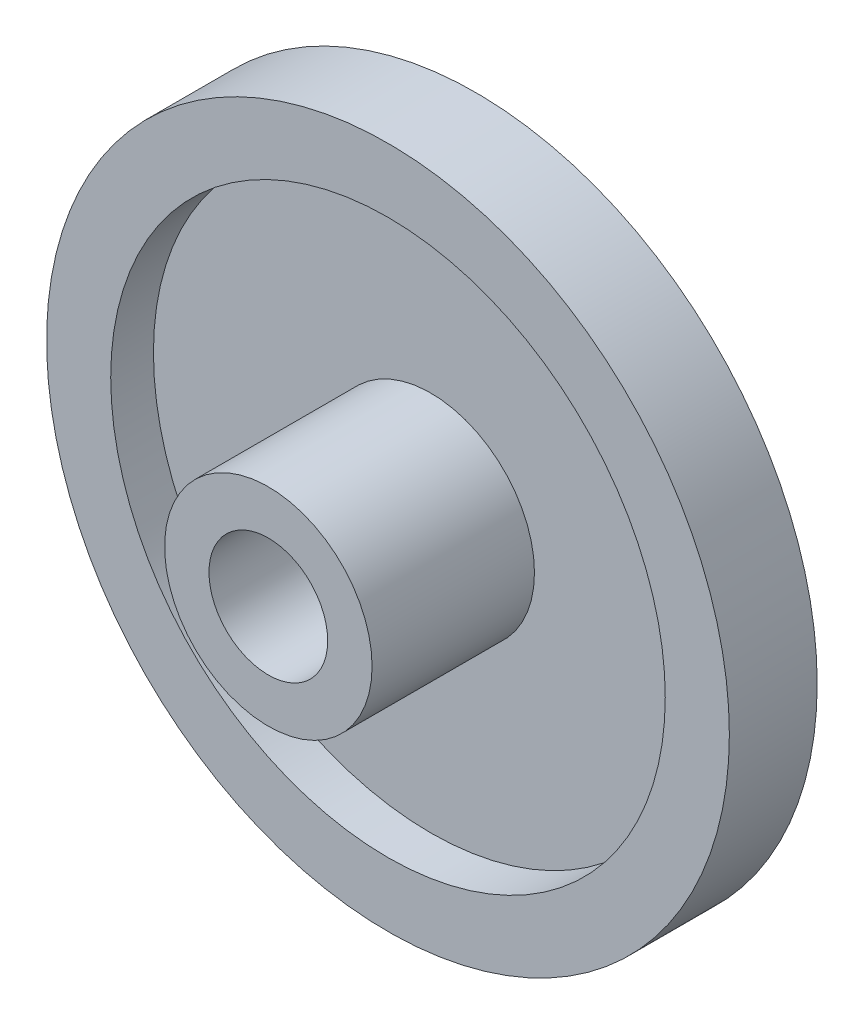
ISO-10303-21;
HEADER;
FILE_DESCRIPTION(('STEP AP214'),'2;1');
FILE_NAME('part.step','',(''),(''),'','','');
FILE_SCHEMA(('AUTOMOTIVE_DESIGN { 1 0 10303 214 1 1 1 1 }'));
ENDSEC;
DATA;
#1=APPLICATION_CONTEXT('core data for automotive mechanical design processes');
#2=APPLICATION_PROTOCOL_DEFINITION('international standard','automotive_design',2000,#1);
#3=PRODUCT_CONTEXT('',#1,'mechanical');
#4=PRODUCT('Part','Part','',(#3));
#5=PRODUCT_RELATED_PRODUCT_CATEGORY('part','',(#4));
#6=PRODUCT_DEFINITION_FORMATION('','',#4);
#7=PRODUCT_DEFINITION_CONTEXT('part definition',#1,'design');
#8=PRODUCT_DEFINITION('design','',#6,#7);
#9=PRODUCT_DEFINITION_SHAPE('','',#8);
#10=(LENGTH_UNIT() NAMED_UNIT(*) SI_UNIT(.MILLI.,.METRE.));
#11=(NAMED_UNIT(*) PLANE_ANGLE_UNIT() SI_UNIT($,.RADIAN.));
#12=(NAMED_UNIT(*) SI_UNIT($,.STERADIAN.) SOLID_ANGLE_UNIT());
#13=UNCERTAINTY_MEASURE_WITH_UNIT(LENGTH_MEASURE(1.E-05),#10,'distance_accuracy_value','');
#14=(GEOMETRIC_REPRESENTATION_CONTEXT(3) GLOBAL_UNCERTAINTY_ASSIGNED_CONTEXT((#13)) GLOBAL_UNIT_ASSIGNED_CONTEXT((#10,
#11,#12)) REPRESENTATION_CONTEXT('',''));
#15=CARTESIAN_POINT('',(0.,0.,0.));
#16=DIRECTION('',(0.,0.,1.));
#17=DIRECTION('',(1.,0.,0.));
#18=AXIS2_PLACEMENT_3D('',#15,#16,#17);
#19=CARTESIAN_POINT('',(0.,3.175,0.));
#20=DIRECTION('',(0.,0.,1.));
#21=DIRECTION('',(1.,0.,0.));
#22=AXIS2_PLACEMENT_3D('',#19,#20,#21);
#23=PLANE('',#22);
#24=CARTESIAN_POINT('',(0.,0.,0.));
#25=DIRECTION('',(0.,0.,1.));
#26=DIRECTION('',(1.,0.,0.));
#27=AXIS2_PLACEMENT_3D('',#24,#25,#26);
#28=CIRCLE('',#27,18.2626);
#29=CARTESIAN_POINT('',(18.2626,0.,0.));
#30=VERTEX_POINT('',#29);
#31=EDGE_CURVE('E10',#30,#30,#28,.T.);
#32=ORIENTED_EDGE('',*,*,#31,.F.);
#33=EDGE_LOOP('',(#32));
#34=FACE_BOUND('',#33,.T.);
#35=CARTESIAN_POINT('',(0.,0.,0.));
#36=DIRECTION('',(0.,0.,1.));
#37=DIRECTION('',(1.,0.,0.));
#38=AXIS2_PLACEMENT_3D('',#35,#36,#37);
#39=CIRCLE('',#38,3.175);
#40=CARTESIAN_POINT('',(3.175,0.,0.));
#41=VERTEX_POINT('',#40);
#42=EDGE_CURVE('E60',#41,#41,#39,.T.);
#43=ORIENTED_EDGE('',*,*,#42,.T.);
#44=EDGE_LOOP('',(#43));
#45=FACE_BOUND('',#44,.T.);
#46=ADVANCED_FACE('F32',(#34,#45),#23,.F.);
#47=CARTESIAN_POINT('',(0.,0.,114.88463509104));
#48=DIRECTION('',(0.,0.,1.));
#49=DIRECTION('',(1.,0.,0.));
#50=AXIS2_PLACEMENT_3D('',#47,#48,#49);
#51=CYLINDRICAL_SURFACE('',#50,18.2626);
#52=CARTESIAN_POINT('',(0.,0.,4.69899999999999));
#53=DIRECTION('',(0.,0.,1.));
#54=DIRECTION('',(1.,0.,0.));
#55=AXIS2_PLACEMENT_3D('',#52,#53,#54);
#56=CIRCLE('',#55,18.2626);
#57=CARTESIAN_POINT('',(18.2626,0.,4.69899999999999));
#58=VERTEX_POINT('',#57);
#59=EDGE_CURVE('E38',#58,#58,#56,.T.);
#60=ORIENTED_EDGE('',*,*,#59,.F.);
#61=EDGE_LOOP('',(#60));
#62=FACE_BOUND('',#61,.T.);
#63=ORIENTED_EDGE('',*,*,#31,.T.);
#64=EDGE_LOOP('',(#63));
#65=FACE_BOUND('',#64,.T.);
#66=ADVANCED_FACE('F97',(#62,#65),#51,.T.);
#67=CARTESIAN_POINT('',(0.,18.2626,4.699));
#68=DIRECTION('',(0.,0.,-1.));
#69=DIRECTION('',(-1.,0.,0.));
#70=AXIS2_PLACEMENT_3D('',#67,#68,#69);
#71=PLANE('',#70);
#72=CARTESIAN_POINT('',(0.,0.,4.69899999999999));
#73=DIRECTION('',(0.,0.,1.));
#74=DIRECTION('',(1.,0.,0.));
#75=AXIS2_PLACEMENT_3D('',#72,#73,#74);
#76=CIRCLE('',#75,14.8336);
#77=CARTESIAN_POINT('',(14.8336,0.,4.69899999999999));
#78=VERTEX_POINT('',#77);
#79=EDGE_CURVE('E42',#78,#78,#76,.T.);
#80=ORIENTED_EDGE('',*,*,#79,.F.);
#81=EDGE_LOOP('',(#80));
#82=FACE_BOUND('',#81,.T.);
#83=ORIENTED_EDGE('',*,*,#59,.T.);
#84=EDGE_LOOP('',(#83));
#85=FACE_BOUND('',#84,.T.);
#86=ADVANCED_FACE('F92',(#82,#85),#71,.F.);
#87=CARTESIAN_POINT('',(0.,0.,114.88463509104));
#88=DIRECTION('',(0.,0.,1.));
#89=DIRECTION('',(1.,0.,0.));
#90=AXIS2_PLACEMENT_3D('',#87,#88,#89);
#91=CYLINDRICAL_SURFACE('',#90,14.8336);
#92=CARTESIAN_POINT('',(0.,0.,2.413));
#93=DIRECTION('',(0.,0.,1.));
#94=DIRECTION('',(1.,0.,0.));
#95=AXIS2_PLACEMENT_3D('',#92,#93,#94);
#96=CIRCLE('',#95,14.8336);
#97=CARTESIAN_POINT('',(14.8336,0.,2.413));
#98=VERTEX_POINT('',#97);
#99=EDGE_CURVE('E46',#98,#98,#96,.T.);
#100=ORIENTED_EDGE('',*,*,#99,.F.);
#101=EDGE_LOOP('',(#100));
#102=FACE_BOUND('',#101,.T.);
#103=ORIENTED_EDGE('',*,*,#79,.T.);
#104=EDGE_LOOP('',(#103));
#105=FACE_BOUND('',#104,.T.);
#106=ADVANCED_FACE('F86',(#102,#105),#91,.F.);
#107=CARTESIAN_POINT('',(0.,14.8336,2.413));
#108=DIRECTION('',(0.,0.,-1.));
#109=DIRECTION('',(-1.,0.,0.));
#110=AXIS2_PLACEMENT_3D('',#107,#108,#109);
#111=PLANE('',#110);
#112=CARTESIAN_POINT('',(0.,0.,2.413));
#113=DIRECTION('',(0.,0.,1.));
#114=DIRECTION('',(1.,0.,0.));
#115=AXIS2_PLACEMENT_3D('',#112,#113,#114);
#116=CIRCLE('',#115,5.5499);
#117=CARTESIAN_POINT('',(5.5499,0.,2.413));
#118=VERTEX_POINT('',#117);
#119=EDGE_CURVE('E51',#118,#118,#116,.T.);
#120=ORIENTED_EDGE('',*,*,#119,.F.);
#121=EDGE_LOOP('',(#120));
#122=FACE_BOUND('',#121,.T.);
#123=ORIENTED_EDGE('',*,*,#99,.T.);
#124=EDGE_LOOP('',(#123));
#125=FACE_BOUND('',#124,.T.);
#126=ADVANCED_FACE('F80',(#122,#125),#111,.F.);
#127=CARTESIAN_POINT('',(0.,0.,114.88463509104));
#128=DIRECTION('',(0.,0.,1.));
#129=DIRECTION('',(1.,0.,0.));
#130=AXIS2_PLACEMENT_3D('',#127,#128,#129);
#131=CYLINDRICAL_SURFACE('',#130,5.5499);
#132=CARTESIAN_POINT('',(0.,0.,11.0998));
#133=DIRECTION('',(0.,0.,1.));
#134=DIRECTION('',(1.,0.,0.));
#135=AXIS2_PLACEMENT_3D('',#132,#133,#134);
#136=CIRCLE('',#135,5.5499);
#137=CARTESIAN_POINT('',(5.5499,0.,11.0998));
#138=VERTEX_POINT('',#137);
#139=EDGE_CURVE('E54',#138,#138,#136,.T.);
#140=ORIENTED_EDGE('',*,*,#139,.F.);
#141=EDGE_LOOP('',(#140));
#142=FACE_BOUND('',#141,.T.);
#143=ORIENTED_EDGE('',*,*,#119,.T.);
#144=EDGE_LOOP('',(#143));
#145=FACE_BOUND('',#144,.T.);
#146=ADVANCED_FACE('F74',(#142,#145),#131,.T.);
#147=CARTESIAN_POINT('',(0.,5.5499,11.0998));
#148=DIRECTION('',(0.,0.,-1.));
#149=DIRECTION('',(-1.,0.,0.));
#150=AXIS2_PLACEMENT_3D('',#147,#148,#149);
#151=PLANE('',#150);
#152=CARTESIAN_POINT('',(0.,0.,11.0998));
#153=DIRECTION('',(0.,0.,1.));
#154=DIRECTION('',(1.,0.,0.));
#155=AXIS2_PLACEMENT_3D('',#152,#153,#154);
#156=CIRCLE('',#155,3.175);
#157=CARTESIAN_POINT('',(3.175,0.,11.0998));
#158=VERTEX_POINT('',#157);
#159=EDGE_CURVE('E57',#158,#158,#156,.T.);
#160=ORIENTED_EDGE('',*,*,#159,.F.);
#161=EDGE_LOOP('',(#160));
#162=FACE_BOUND('',#161,.T.);
#163=ORIENTED_EDGE('',*,*,#139,.T.);
#164=EDGE_LOOP('',(#163));
#165=FACE_BOUND('',#164,.T.);
#166=ADVANCED_FACE('F68',(#162,#165),#151,.F.);
#167=CARTESIAN_POINT('',(0.,0.,114.88463509104));
#168=DIRECTION('',(0.,0.,1.));
#169=DIRECTION('',(1.,0.,0.));
#170=AXIS2_PLACEMENT_3D('',#167,#168,#169);
#171=CYLINDRICAL_SURFACE('',#170,3.175);
#172=ORIENTED_EDGE('',*,*,#42,.F.);
#173=EDGE_LOOP('',(#172));
#174=FACE_BOUND('',#173,.T.);
#175=ORIENTED_EDGE('',*,*,#159,.T.);
#176=EDGE_LOOP('',(#175));
#177=FACE_BOUND('',#176,.T.);
#178=ADVANCED_FACE('F65',(#174,#177),#171,.F.);
#179=CLOSED_SHELL('',(#46,#66,#86,#106,#126,#146,#166,#178));
#180=MANIFOLD_SOLID_BREP('B2',#179);
#181=ADVANCED_BREP_SHAPE_REPRESENTATION('',(#18,#180),#14);
#182=SHAPE_DEFINITION_REPRESENTATION(#9,#181);
ENDSEC;
END-ISO-10303-21;
